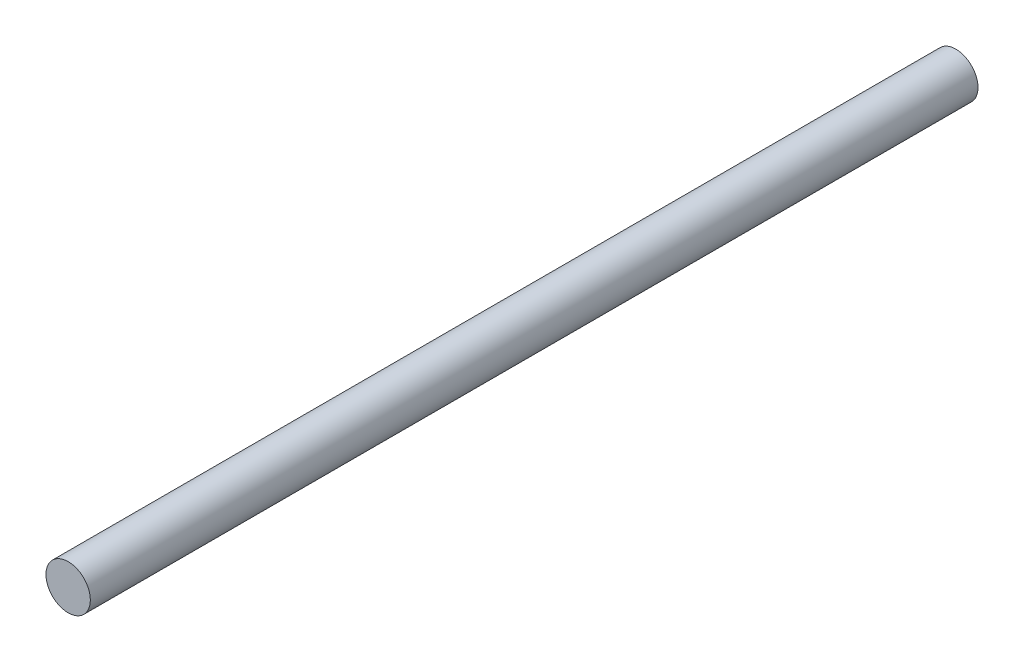
ISO-10303-21;
HEADER;
FILE_DESCRIPTION(('STEP AP214'),'2;1');
FILE_NAME('part.step','',(''),(''),'','','');
FILE_SCHEMA(('AUTOMOTIVE_DESIGN { 1 0 10303 214 1 1 1 1 }'));
ENDSEC;
DATA;
#1=APPLICATION_CONTEXT('core data for automotive mechanical design processes');
#2=APPLICATION_PROTOCOL_DEFINITION('international standard','automotive_design',2000,#1);
#3=PRODUCT_CONTEXT('',#1,'mechanical');
#4=PRODUCT('Part','Part','',(#3));
#5=PRODUCT_RELATED_PRODUCT_CATEGORY('part','',(#4));
#6=PRODUCT_DEFINITION_FORMATION('','',#4);
#7=PRODUCT_DEFINITION_CONTEXT('part definition',#1,'design');
#8=PRODUCT_DEFINITION('design','',#6,#7);
#9=PRODUCT_DEFINITION_SHAPE('','',#8);
#10=(LENGTH_UNIT() NAMED_UNIT(*) SI_UNIT(.MILLI.,.METRE.));
#11=(NAMED_UNIT(*) PLANE_ANGLE_UNIT() SI_UNIT($,.RADIAN.));
#12=(NAMED_UNIT(*) SI_UNIT($,.STERADIAN.) SOLID_ANGLE_UNIT());
#13=UNCERTAINTY_MEASURE_WITH_UNIT(LENGTH_MEASURE(1.E-05),#10,'distance_accuracy_value','');
#14=(GEOMETRIC_REPRESENTATION_CONTEXT(3) GLOBAL_UNCERTAINTY_ASSIGNED_CONTEXT((#13)) GLOBAL_UNIT_ASSIGNED_CONTEXT((#10,
#11,#12)) REPRESENTATION_CONTEXT('',''));
#15=CARTESIAN_POINT('',(0.,0.,0.));
#16=DIRECTION('',(0.,0.,1.));
#17=DIRECTION('',(1.,0.,0.));
#18=AXIS2_PLACEMENT_3D('',#15,#16,#17);
#19=CARTESIAN_POINT('',(0.,0.,100.));
#20=DIRECTION('',(0.,0.,-1.));
#21=DIRECTION('',(-1.,0.,0.));
#22=AXIS2_PLACEMENT_3D('',#19,#20,#21);
#23=CYLINDRICAL_SURFACE('',#22,2.5);
#24=CARTESIAN_POINT('',(0.,0.,100.));
#25=DIRECTION('',(0.,0.,1.));
#26=DIRECTION('',(1.,0.,0.));
#27=AXIS2_PLACEMENT_3D('',#24,#25,#26);
#28=CIRCLE('',#27,2.5);
#29=CARTESIAN_POINT('',(2.5,0.,100.));
#30=VERTEX_POINT('',#29);
#31=EDGE_CURVE('E10',#30,#30,#28,.T.);
#32=ORIENTED_EDGE('',*,*,#31,.F.);
#33=EDGE_LOOP('',(#32));
#34=FACE_BOUND('',#33,.T.);
#35=CARTESIAN_POINT('',(0.,0.,0.));
#36=DIRECTION('',(0.,0.,1.));
#37=DIRECTION('',(1.,0.,0.));
#38=AXIS2_PLACEMENT_3D('',#35,#36,#37);
#39=CIRCLE('',#38,2.5);
#40=CARTESIAN_POINT('',(2.5,0.,0.));
#41=VERTEX_POINT('',#40);
#42=EDGE_CURVE('E40',#41,#41,#39,.T.);
#43=ORIENTED_EDGE('',*,*,#42,.T.);
#44=EDGE_LOOP('',(#43));
#45=FACE_BOUND('',#44,.T.);
#46=ADVANCED_FACE('F37',(#34,#45),#23,.T.);
#47=CARTESIAN_POINT('',(0.,0.,100.));
#48=DIRECTION('',(0.,0.,1.));
#49=DIRECTION('',(1.,0.,0.));
#50=AXIS2_PLACEMENT_3D('',#47,#48,#49);
#51=PLANE('',#50);
#52=ORIENTED_EDGE('',*,*,#31,.T.);
#53=EDGE_LOOP('',(#52));
#54=FACE_BOUND('',#53,.T.);
#55=ADVANCED_FACE('F54',(#54),#51,.T.);
#56=CARTESIAN_POINT('',(0.,0.,0.));
#57=DIRECTION('',(0.,0.,1.));
#58=DIRECTION('',(1.,0.,0.));
#59=AXIS2_PLACEMENT_3D('',#56,#57,#58);
#60=PLANE('',#59);
#61=ORIENTED_EDGE('',*,*,#42,.F.);
#62=EDGE_LOOP('',(#61));
#63=FACE_BOUND('',#62,.T.);
#64=ADVANCED_FACE('F52',(#63),#60,.F.);
#65=CLOSED_SHELL('',(#46,#55,#64));
#66=MANIFOLD_SOLID_BREP('B2',#65);
#67=ADVANCED_BREP_SHAPE_REPRESENTATION('',(#18,#66),#14);
#68=SHAPE_DEFINITION_REPRESENTATION(#9,#67);
ENDSEC;
END-ISO-10303-21;
